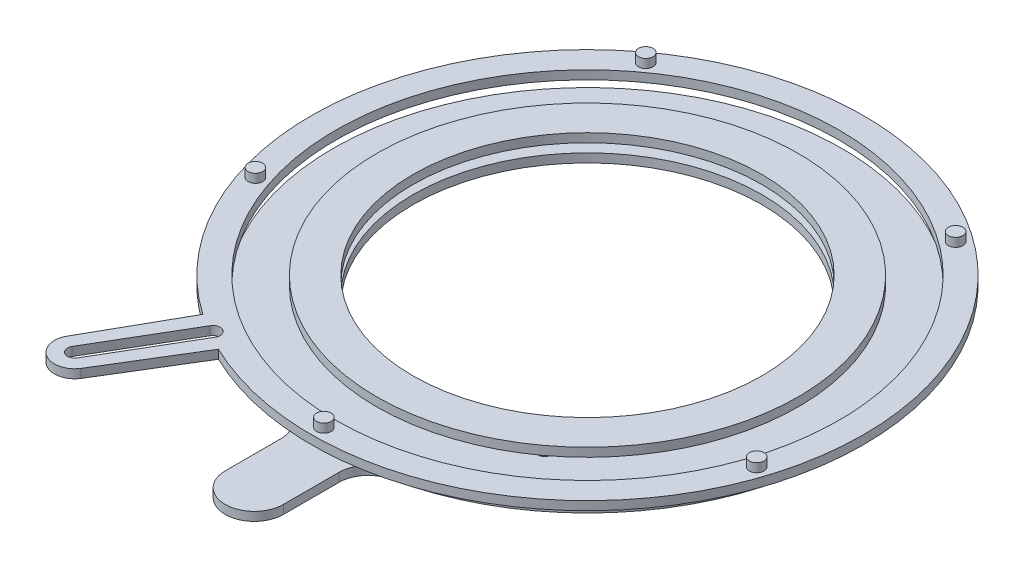
ISO-10303-21;
HEADER;
FILE_DESCRIPTION(('STEP AP214'),'2;1');
FILE_NAME('part.step','',(''),(''),'','','');
FILE_SCHEMA(('AUTOMOTIVE_DESIGN { 1 0 10303 214 1 1 1 1 }'));
ENDSEC;
DATA;
#1=APPLICATION_CONTEXT('core data for automotive mechanical design processes');
#2=APPLICATION_PROTOCOL_DEFINITION('international standard','automotive_design',2000,#1);
#3=PRODUCT_CONTEXT('',#1,'mechanical');
#4=PRODUCT('Part','Part','',(#3));
#5=PRODUCT_RELATED_PRODUCT_CATEGORY('part','',(#4));
#6=PRODUCT_DEFINITION_FORMATION('','',#4);
#7=PRODUCT_DEFINITION_CONTEXT('part definition',#1,'design');
#8=PRODUCT_DEFINITION('design','',#6,#7);
#9=PRODUCT_DEFINITION_SHAPE('','',#8);
#10=(LENGTH_UNIT() NAMED_UNIT(*) SI_UNIT(.MILLI.,.METRE.));
#11=(NAMED_UNIT(*) PLANE_ANGLE_UNIT() SI_UNIT($,.RADIAN.));
#12=(NAMED_UNIT(*) SI_UNIT($,.STERADIAN.) SOLID_ANGLE_UNIT());
#13=UNCERTAINTY_MEASURE_WITH_UNIT(LENGTH_MEASURE(1.E-05),#10,'distance_accuracy_value','');
#14=(GEOMETRIC_REPRESENTATION_CONTEXT(3) GLOBAL_UNCERTAINTY_ASSIGNED_CONTEXT((#13)) GLOBAL_UNIT_ASSIGNED_CONTEXT((#10,
#11,#12)) REPRESENTATION_CONTEXT('',''));
#15=CARTESIAN_POINT('',(0.,0.,0.));
#16=DIRECTION('',(0.,0.,1.));
#17=DIRECTION('',(1.,0.,0.));
#18=AXIS2_PLACEMENT_3D('',#15,#16,#17);
#19=CARTESIAN_POINT('',(-65.2234369421148,3.,111.10996485598));
#20=DIRECTION('',(0.,1.,0.));
#21=DIRECTION('',(0.,0.,1.));
#22=AXIS2_PLACEMENT_3D('',#19,#20,#21);
#23=PLANE('',#22);
#24=CARTESIAN_POINT('',(-86.2062632660735,3.,28.0101128737876));
#25=DIRECTION('',(0.,1.,0.));
#26=DIRECTION('',(-0.95105651629515,0.,0.309016994374958));
#27=AXIS2_PLACEMENT_3D('',#24,#25,#26);
#28=CIRCLE('',#27,2.5);
#29=CARTESIAN_POINT('',(-88.5839045568114,3.,28.782655359725));
#30=VERTEX_POINT('',#29);
#31=EDGE_CURVE('E129',#30,#30,#28,.T.);
#32=ORIENTED_EDGE('',*,*,#31,.F.);
#33=EDGE_LOOP('',(#32));
#34=FACE_BOUND('',#33,.T.);
#35=CARTESIAN_POINT('',(-53.2784007415558,3.,-73.331427532294));
#36=DIRECTION('',(0.,1.,0.));
#37=DIRECTION('',(-0.58778525229248,0.,-0.809016994374942));
#38=AXIS2_PLACEMENT_3D('',#35,#36,#37);
#39=CIRCLE('',#38,2.5);
#40=CARTESIAN_POINT('',(-54.747863872287,3.,-75.3539700182314));
#41=VERTEX_POINT('',#40);
#42=EDGE_CURVE('E152',#41,#41,#39,.T.);
#43=ORIENTED_EDGE('',*,*,#42,.F.);
#44=EDGE_LOOP('',(#43));
#45=FACE_BOUND('',#44,.T.);
#46=CARTESIAN_POINT('',(53.2784007415547,3.,-73.3314275322948));
#47=DIRECTION('',(0.,1.,0.));
#48=DIRECTION('',(0.587785252292469,0.,-0.809016994374951));
#49=AXIS2_PLACEMENT_3D('',#46,#47,#48);
#50=CIRCLE('',#49,2.5);
#51=CARTESIAN_POINT('',(54.7478638722859,3.,-75.3539700182321));
#52=VERTEX_POINT('',#51);
#53=EDGE_CURVE('E158',#52,#52,#50,.T.);
#54=ORIENTED_EDGE('',*,*,#53,.F.);
#55=EDGE_LOOP('',(#54));
#56=FACE_BOUND('',#55,.T.);
#57=CARTESIAN_POINT('',(86.2062632660739,3.,28.0101128737864));
#58=DIRECTION('',(0.,1.,0.));
#59=DIRECTION('',(0.951056516295155,0.,0.309016994374945));
#60=AXIS2_PLACEMENT_3D('',#57,#58,#59);
#61=CIRCLE('',#60,2.5);
#62=CARTESIAN_POINT('',(88.5839045568118,3.,28.7826553597238));
#63=VERTEX_POINT('',#62);
#64=EDGE_CURVE('E164',#63,#63,#61,.T.);
#65=ORIENTED_EDGE('',*,*,#64,.F.);
#66=EDGE_LOOP('',(#65));
#67=FACE_BOUND('',#66,.T.);
#68=CARTESIAN_POINT('',(0.,3.,90.6426293170156));
#69=DIRECTION('',(0.,1.,0.));
#70=DIRECTION('',(0.,0.,1.));
#71=AXIS2_PLACEMENT_3D('',#68,#69,#70);
#72=CIRCLE('',#71,2.5);
#73=CARTESIAN_POINT('',(0.,3.,93.1426293170156));
#74=VERTEX_POINT('',#73);
#75=EDGE_CURVE('E170',#74,#74,#72,.T.);
#76=ORIENTED_EDGE('',*,*,#75,.F.);
#77=EDGE_LOOP('',(#76));
#78=FACE_BOUND('',#77,.T.);
#79=CARTESIAN_POINT('',(-65.2234369421148,3.,111.10996485598));
#80=DIRECTION('',(0.,1.,0.));
#81=DIRECTION('',(0.,0.,1.));
#82=AXIS2_PLACEMENT_3D('',#79,#80,#81);
#83=CIRCLE('',#82,7.);
#84=CARTESIAN_POINT('',(-71.2350289516184,3.,107.523774466267));
#85=VERTEX_POINT('',#84);
#86=CARTESIAN_POINT('',(-59.3384338554631,3.,114.900312949506));
#87=VERTEX_POINT('',#86);
#88=EDGE_CURVE('E185',#85,#87,#83,.T.);
#89=ORIENTED_EDGE('',*,*,#88,.T.);
#90=DIRECTION('',(0.520962189839159,0.,-0.853579754187028));
#91=VECTOR('',#90,1.);
#92=CARTESIAN_POINT('',(-59.3384338554631,3.,114.900312949506));
#93=LINE('',#92,#91);
#94=CARTESIAN_POINT('',(-41.3980460225497,3.,85.5055658160032));
#95=VERTEX_POINT('',#94);
#96=EDGE_CURVE('E188',#87,#95,#93,.T.);
#97=ORIENTED_EDGE('',*,*,#96,.T.);
#98=CARTESIAN_POINT('',(0.,3.,0.));
#99=DIRECTION('',(0.,1.,0.));
#100=DIRECTION('',(0.,0.,1.));
#101=AXIS2_PLACEMENT_3D('',#98,#99,#100);
#102=CIRCLE('',#101,95.);
#103=CARTESIAN_POINT('',(-54.4803694238336,3.,77.8260197327514));
#104=VERTEX_POINT('',#103);
#105=EDGE_CURVE('E191',#95,#104,#102,.T.);
#106=ORIENTED_EDGE('',*,*,#105,.T.);
#107=DIRECTION('',(-0.491367460051332,0.,0.870952363337228));
#108=VECTOR('',#107,1.);
#109=CARTESIAN_POINT('',(-71.2350289516184,3.,107.523774466267));
#110=LINE('',#109,#108);
#111=EDGE_CURVE('E193',#104,#85,#110,.T.);
#112=ORIENTED_EDGE('',*,*,#111,.T.);
#113=EDGE_LOOP('',(#89,#97,#106,#112));
#114=FACE_BOUND('',#113,.T.);
#115=CARTESIAN_POINT('',(0.,3.,0.));
#116=DIRECTION('',(0.,1.,0.));
#117=DIRECTION('',(0.,0.,1.));
#118=AXIS2_PLACEMENT_3D('',#115,#116,#117);
#119=CIRCLE('',#118,86.5);
#120=CARTESIAN_POINT('',(0.,3.,86.5));
#121=VERTEX_POINT('',#120);
#122=EDGE_CURVE('E179',#121,#121,#119,.T.);
#123=ORIENTED_EDGE('',*,*,#122,.F.);
#124=EDGE_LOOP('',(#123));
#125=FACE_BOUND('',#124,.T.);
#126=DIRECTION('',(0.506239352380876,0.,-0.862393018351257));
#127=VECTOR('',#126,1.);
#128=CARTESIAN_POINT('',(-63.0674543962367,3.,112.375563236932));
#129=LINE('',#128,#127);
#130=CARTESIAN_POINT('',(-63.0674543962367,3.,112.375563236932));
#131=VERTEX_POINT('',#130);
#132=CARTESIAN_POINT('',(-45.5100512310858,3.,82.4660316313913));
#133=VERTEX_POINT('',#132);
#134=EDGE_CURVE('E121',#131,#133,#129,.T.);
#135=ORIENTED_EDGE('',*,*,#134,.F.);
#136=CARTESIAN_POINT('',(-65.2234369421148,3.,111.10996485598));
#137=DIRECTION('',(0.,1.,0.));
#138=DIRECTION('',(0.,0.,1.));
#139=AXIS2_PLACEMENT_3D('',#136,#137,#138);
#140=CIRCLE('',#139,2.49999999999999);
#141=CARTESIAN_POINT('',(-67.379419487993,3.,109.844366475028));
#142=VERTEX_POINT('',#141);
#143=EDGE_CURVE('E113',#142,#131,#140,.T.);
#144=ORIENTED_EDGE('',*,*,#143,.F.);
#145=DIRECTION('',(-0.506239352380876,0.,0.862393018351257));
#146=VECTOR('',#145,1.);
#147=CARTESIAN_POINT('',(-67.379419487993,3.,109.844366475028));
#148=LINE('',#147,#146);
#149=CARTESIAN_POINT('',(-49.8220163228421,3.,79.9348348694869));
#150=VERTEX_POINT('',#149);
#151=EDGE_CURVE('E135',#150,#142,#148,.T.);
#152=ORIENTED_EDGE('',*,*,#151,.F.);
#153=CARTESIAN_POINT('',(-47.666033776964,3.,81.2004332504391));
#154=DIRECTION('',(0.,1.,0.));
#155=DIRECTION('',(0.,0.,1.));
#156=AXIS2_PLACEMENT_3D('',#153,#154,#155);
#157=CIRCLE('',#156,2.49999999999999);
#158=EDGE_CURVE('E133',#133,#150,#157,.T.);
#159=ORIENTED_EDGE('',*,*,#158,.F.);
#160=EDGE_LOOP('',(#135,#144,#152,#159));
#161=FACE_BOUND('',#160,.T.);
#162=ADVANCED_FACE('F48',(#34,#45,#56,#67,#78,#114,#125,#161),#23,.T.);
#163=CARTESIAN_POINT('',(-65.2234369421148,0.,111.10996485598));
#164=DIRECTION('',(0.,1.,0.));
#165=DIRECTION('',(0.,0.,1.));
#166=AXIS2_PLACEMENT_3D('',#163,#164,#165);
#167=PLANE('',#166);
#168=CARTESIAN_POINT('',(0.,0.,0.));
#169=DIRECTION('',(0.,1.,0.));
#170=DIRECTION('',(0.,0.,1.));
#171=AXIS2_PLACEMENT_3D('',#168,#169,#170);
#172=CIRCLE('',#171,86.5);
#173=CARTESIAN_POINT('',(0.,0.,86.5));
#174=VERTEX_POINT('',#173);
#175=EDGE_CURVE('E176',#174,#174,#172,.T.);
#176=ORIENTED_EDGE('',*,*,#175,.T.);
#177=EDGE_LOOP('',(#176));
#178=FACE_BOUND('',#177,.T.);
#179=CARTESIAN_POINT('',(-65.2234369421148,0.,111.10996485598));
#180=DIRECTION('',(0.,1.,0.));
#181=DIRECTION('',(0.,0.,1.));
#182=AXIS2_PLACEMENT_3D('',#179,#180,#181);
#183=CIRCLE('',#182,7.);
#184=CARTESIAN_POINT('',(-71.2350289516184,0.,107.523774466267));
#185=VERTEX_POINT('',#184);
#186=CARTESIAN_POINT('',(-59.3384338554631,0.,114.900312949506));
#187=VERTEX_POINT('',#186);
#188=EDGE_CURVE('E182',#185,#187,#183,.T.);
#189=ORIENTED_EDGE('',*,*,#188,.F.);
#190=DIRECTION('',(-0.491367460051332,0.,0.870952363337228));
#191=VECTOR('',#190,1.);
#192=CARTESIAN_POINT('',(-71.2350289516184,0.,107.523774466267));
#193=LINE('',#192,#191);
#194=CARTESIAN_POINT('',(-54.4803694238336,0.,77.8260197327514));
#195=VERTEX_POINT('',#194);
#196=EDGE_CURVE('E189',#195,#185,#193,.T.);
#197=ORIENTED_EDGE('',*,*,#196,.F.);
#198=CARTESIAN_POINT('',(0.,0.,0.));
#199=DIRECTION('',(0.,1.,0.));
#200=DIRECTION('',(0.,0.,1.));
#201=AXIS2_PLACEMENT_3D('',#198,#199,#200);
#202=CIRCLE('',#201,95.);
#203=CARTESIAN_POINT('',(-41.3980460225497,0.,85.5055658160032));
#204=VERTEX_POINT('',#203);
#205=EDGE_CURVE('E200',#204,#195,#202,.T.);
#206=ORIENTED_EDGE('',*,*,#205,.F.);
#207=DIRECTION('',(0.520962189839159,0.,-0.853579754187028));
#208=VECTOR('',#207,1.);
#209=CARTESIAN_POINT('',(-59.3384338554631,0.,114.900312949506));
#210=LINE('',#209,#208);
#211=EDGE_CURVE('E198',#187,#204,#210,.T.);
#212=ORIENTED_EDGE('',*,*,#211,.F.);
#213=EDGE_LOOP('',(#189,#197,#206,#212));
#214=FACE_BOUND('',#213,.T.);
#215=CARTESIAN_POINT('',(-65.2234369421148,0.,111.10996485598));
#216=DIRECTION('',(0.,1.,0.));
#217=DIRECTION('',(0.,0.,1.));
#218=AXIS2_PLACEMENT_3D('',#215,#216,#217);
#219=CIRCLE('',#218,2.49999999999999);
#220=CARTESIAN_POINT('',(-67.379419487993,0.,109.844366475028));
#221=VERTEX_POINT('',#220);
#222=CARTESIAN_POINT('',(-63.0674543962367,0.,112.375563236932));
#223=VERTEX_POINT('',#222);
#224=EDGE_CURVE('E71',#221,#223,#219,.T.);
#225=ORIENTED_EDGE('',*,*,#224,.T.);
#226=DIRECTION('',(0.506239352380876,0.,-0.862393018351257));
#227=VECTOR('',#226,1.);
#228=CARTESIAN_POINT('',(-63.0674543962367,0.,112.375563236932));
#229=LINE('',#228,#227);
#230=CARTESIAN_POINT('',(-45.5100512310858,0.,82.4660316313913));
#231=VERTEX_POINT('',#230);
#232=EDGE_CURVE('E128',#223,#231,#229,.T.);
#233=ORIENTED_EDGE('',*,*,#232,.T.);
#234=CARTESIAN_POINT('',(-47.666033776964,0.,81.2004332504391));
#235=DIRECTION('',(0.,1.,0.));
#236=DIRECTION('',(0.,0.,1.));
#237=AXIS2_PLACEMENT_3D('',#234,#235,#236);
#238=CIRCLE('',#237,2.49999999999999);
#239=CARTESIAN_POINT('',(-49.8220163228421,0.,79.9348348694869));
#240=VERTEX_POINT('',#239);
#241=EDGE_CURVE('E141',#231,#240,#238,.T.);
#242=ORIENTED_EDGE('',*,*,#241,.T.);
#243=DIRECTION('',(-0.506239352380876,0.,0.862393018351257));
#244=VECTOR('',#243,1.);
#245=CARTESIAN_POINT('',(-67.379419487993,0.,109.844366475028));
#246=LINE('',#245,#244);
#247=EDGE_CURVE('E122',#240,#221,#246,.T.);
#248=ORIENTED_EDGE('',*,*,#247,.T.);
#249=EDGE_LOOP('',(#225,#233,#242,#248));
#250=FACE_BOUND('',#249,.T.);
#251=ADVANCED_FACE('F218',(#178,#214,#250),#167,.F.);
#252=CARTESIAN_POINT('',(-65.2234369421148,3.,111.10996485598));
#253=DIRECTION('',(0.,-1.,0.));
#254=DIRECTION('',(0.,0.,-1.));
#255=AXIS2_PLACEMENT_3D('',#252,#253,#254);
#256=CYLINDRICAL_SURFACE('',#255,7.);
#257=ORIENTED_EDGE('',*,*,#188,.T.);
#258=DIRECTION('',(0.,-1.,0.));
#259=VECTOR('',#258,1.);
#260=CARTESIAN_POINT('',(-59.3384338554631,3.,114.900312949506));
#261=LINE('',#260,#259);
#262=EDGE_CURVE('E12',#87,#187,#261,.T.);
#263=ORIENTED_EDGE('',*,*,#262,.F.);
#264=ORIENTED_EDGE('',*,*,#88,.F.);
#265=DIRECTION('',(0.,-1.,0.));
#266=VECTOR('',#265,1.);
#267=CARTESIAN_POINT('',(-71.2350289516184,3.,107.523774466267));
#268=LINE('',#267,#266);
#269=EDGE_CURVE('E195',#85,#185,#268,.T.);
#270=ORIENTED_EDGE('',*,*,#269,.T.);
#271=EDGE_LOOP('',(#257,#263,#264,#270));
#272=FACE_BOUND('',#271,.T.);
#273=ADVANCED_FACE('F50',(#272),#256,.T.);
#274=CARTESIAN_POINT('',(-59.3384338554631,3.,114.900312949506));
#275=DIRECTION('',(-0.853579754187028,0.,-0.520962189839159));
#276=DIRECTION('',(-0.520962189839159,0.,0.853579754187029));
#277=AXIS2_PLACEMENT_3D('',#274,#275,#276);
#278=PLANE('',#277);
#279=ORIENTED_EDGE('',*,*,#211,.T.);
#280=DIRECTION('',(0.,-1.,0.));
#281=VECTOR('',#280,1.);
#282=CARTESIAN_POINT('',(-41.3980460225497,3.,85.5055658160032));
#283=LINE('',#282,#281);
#284=EDGE_CURVE('E56',#95,#204,#283,.T.);
#285=ORIENTED_EDGE('',*,*,#284,.F.);
#286=ORIENTED_EDGE('',*,*,#96,.F.);
#287=ORIENTED_EDGE('',*,*,#262,.T.);
#288=EDGE_LOOP('',(#279,#285,#286,#287));
#289=FACE_BOUND('',#288,.T.);
#290=ADVANCED_FACE('F229',(#289),#278,.F.);
#291=CARTESIAN_POINT('',(0.,3.,0.));
#292=DIRECTION('',(0.,-1.,0.));
#293=DIRECTION('',(0.,0.,-1.));
#294=AXIS2_PLACEMENT_3D('',#291,#292,#293);
#295=CYLINDRICAL_SURFACE('',#294,95.);
#296=ORIENTED_EDGE('',*,*,#205,.T.);
#297=DIRECTION('',(0.,-1.,0.));
#298=VECTOR('',#297,1.);
#299=CARTESIAN_POINT('',(-54.4803694238336,3.,77.8260197327514));
#300=LINE('',#299,#298);
#301=EDGE_CURVE('E205',#104,#195,#300,.T.);
#302=ORIENTED_EDGE('',*,*,#301,.F.);
#303=ORIENTED_EDGE('',*,*,#105,.F.);
#304=ORIENTED_EDGE('',*,*,#284,.T.);
#305=EDGE_LOOP('',(#296,#302,#303,#304));
#306=FACE_BOUND('',#305,.T.);
#307=ADVANCED_FACE('F212',(#306),#295,.T.);
#308=CARTESIAN_POINT('',(-71.2350289516184,3.,107.523774466267));
#309=DIRECTION('',(0.870952363337228,0.,0.491367460051332));
#310=DIRECTION('',(0.491367460051332,0.,-0.870952363337228));
#311=AXIS2_PLACEMENT_3D('',#308,#309,#310);
#312=PLANE('',#311);
#313=ORIENTED_EDGE('',*,*,#196,.T.);
#314=ORIENTED_EDGE('',*,*,#269,.F.);
#315=ORIENTED_EDGE('',*,*,#111,.F.);
#316=ORIENTED_EDGE('',*,*,#301,.T.);
#317=EDGE_LOOP('',(#313,#314,#315,#316));
#318=FACE_BOUND('',#317,.T.);
#319=ADVANCED_FACE('F222',(#318),#312,.F.);
#320=CARTESIAN_POINT('',(0.,3.,0.));
#321=DIRECTION('',(0.,-1.,0.));
#322=DIRECTION('',(0.,0.,-1.));
#323=AXIS2_PLACEMENT_3D('',#320,#321,#322);
#324=CYLINDRICAL_SURFACE('',#323,86.5);
#325=ORIENTED_EDGE('',*,*,#122,.T.);
#326=EDGE_LOOP('',(#325));
#327=FACE_BOUND('',#326,.T.);
#328=ORIENTED_EDGE('',*,*,#175,.F.);
#329=EDGE_LOOP('',(#328));
#330=FACE_BOUND('',#329,.T.);
#331=ADVANCED_FACE('F247',(#327,#330),#324,.F.);
#332=CARTESIAN_POINT('',(0.,6.,90.6426293170156));
#333=DIRECTION('',(0.,-1.,0.));
#334=DIRECTION('',(0.,0.,-1.));
#335=AXIS2_PLACEMENT_3D('',#332,#333,#334);
#336=CYLINDRICAL_SURFACE('',#335,2.5);
#337=CARTESIAN_POINT('',(0.,6.,90.6426293170156));
#338=DIRECTION('',(0.,1.,0.));
#339=DIRECTION('',(0.,0.,1.));
#340=AXIS2_PLACEMENT_3D('',#337,#338,#339);
#341=CIRCLE('',#340,2.5);
#342=CARTESIAN_POINT('',(0.,6.,93.1426293170156));
#343=VERTEX_POINT('',#342);
#344=EDGE_CURVE('E173',#343,#343,#341,.T.);
#345=ORIENTED_EDGE('',*,*,#344,.F.);
#346=EDGE_LOOP('',(#345));
#347=FACE_BOUND('',#346,.T.);
#348=ORIENTED_EDGE('',*,*,#75,.T.);
#349=EDGE_LOOP('',(#348));
#350=FACE_BOUND('',#349,.T.);
#351=ADVANCED_FACE('F254',(#347,#350),#336,.T.);
#352=CARTESIAN_POINT('',(0.,6.,90.6426293170156));
#353=DIRECTION('',(0.,1.,0.));
#354=DIRECTION('',(0.,0.,1.));
#355=AXIS2_PLACEMENT_3D('',#352,#353,#354);
#356=PLANE('',#355);
#357=ORIENTED_EDGE('',*,*,#344,.T.);
#358=EDGE_LOOP('',(#357));
#359=FACE_BOUND('',#358,.T.);
#360=ADVANCED_FACE('F259',(#359),#356,.T.);
#361=CARTESIAN_POINT('',(86.2062632660739,6.,28.0101128737864));
#362=DIRECTION('',(0.,-1.,0.));
#363=DIRECTION('',(0.,0.,-1.));
#364=AXIS2_PLACEMENT_3D('',#361,#362,#363);
#365=CYLINDRICAL_SURFACE('',#364,2.5);
#366=CARTESIAN_POINT('',(86.2062632660739,6.,28.0101128737864));
#367=DIRECTION('',(0.,1.,0.));
#368=DIRECTION('',(0.951056516295155,0.,0.309016994374945));
#369=AXIS2_PLACEMENT_3D('',#366,#367,#368);
#370=CIRCLE('',#369,2.5);
#371=CARTESIAN_POINT('',(88.5839045568118,6.,28.7826553597238));
#372=VERTEX_POINT('',#371);
#373=EDGE_CURVE('E167',#372,#372,#370,.T.);
#374=ORIENTED_EDGE('',*,*,#373,.F.);
#375=EDGE_LOOP('',(#374));
#376=FACE_BOUND('',#375,.T.);
#377=ORIENTED_EDGE('',*,*,#64,.T.);
#378=EDGE_LOOP('',(#377));
#379=FACE_BOUND('',#378,.T.);
#380=ADVANCED_FACE('F267',(#376,#379),#365,.T.);
#381=CARTESIAN_POINT('',(86.2062632660739,6.,28.0101128737864));
#382=DIRECTION('',(0.,1.,0.));
#383=DIRECTION('',(0.951056516295155,0.,0.309016994374945));
#384=AXIS2_PLACEMENT_3D('',#381,#382,#383);
#385=PLANE('',#384);
#386=ORIENTED_EDGE('',*,*,#373,.T.);
#387=EDGE_LOOP('',(#386));
#388=FACE_BOUND('',#387,.T.);
#389=ADVANCED_FACE('F275',(#388),#385,.T.);
#390=CARTESIAN_POINT('',(53.2784007415547,6.,-73.3314275322948));
#391=DIRECTION('',(0.,-1.,0.));
#392=DIRECTION('',(0.,0.,-1.));
#393=AXIS2_PLACEMENT_3D('',#390,#391,#392);
#394=CYLINDRICAL_SURFACE('',#393,2.5);
#395=CARTESIAN_POINT('',(53.2784007415547,6.,-73.3314275322948));
#396=DIRECTION('',(0.,1.,0.));
#397=DIRECTION('',(0.587785252292469,0.,-0.809016994374951));
#398=AXIS2_PLACEMENT_3D('',#395,#396,#397);
#399=CIRCLE('',#398,2.5);
#400=CARTESIAN_POINT('',(54.7478638722859,6.,-75.3539700182321));
#401=VERTEX_POINT('',#400);
#402=EDGE_CURVE('E161',#401,#401,#399,.T.);
#403=ORIENTED_EDGE('',*,*,#402,.F.);
#404=EDGE_LOOP('',(#403));
#405=FACE_BOUND('',#404,.T.);
#406=ORIENTED_EDGE('',*,*,#53,.T.);
#407=EDGE_LOOP('',(#406));
#408=FACE_BOUND('',#407,.T.);
#409=ADVANCED_FACE('F279',(#405,#408),#394,.T.);
#410=CARTESIAN_POINT('',(53.2784007415547,6.,-73.3314275322948));
#411=DIRECTION('',(0.,1.,0.));
#412=DIRECTION('',(0.587785252292469,0.,-0.809016994374951));
#413=AXIS2_PLACEMENT_3D('',#410,#411,#412);
#414=PLANE('',#413);
#415=ORIENTED_EDGE('',*,*,#402,.T.);
#416=EDGE_LOOP('',(#415));
#417=FACE_BOUND('',#416,.T.);
#418=ADVANCED_FACE('F283',(#417),#414,.T.);
#419=CARTESIAN_POINT('',(-53.2784007415558,6.,-73.331427532294));
#420=DIRECTION('',(0.,-1.,0.));
#421=DIRECTION('',(0.,0.,-1.));
#422=AXIS2_PLACEMENT_3D('',#419,#420,#421);
#423=CYLINDRICAL_SURFACE('',#422,2.5);
#424=CARTESIAN_POINT('',(-53.2784007415558,6.,-73.331427532294));
#425=DIRECTION('',(0.,1.,0.));
#426=DIRECTION('',(-0.58778525229248,0.,-0.809016994374942));
#427=AXIS2_PLACEMENT_3D('',#424,#425,#426);
#428=CIRCLE('',#427,2.5);
#429=CARTESIAN_POINT('',(-54.747863872287,6.,-75.3539700182314));
#430=VERTEX_POINT('',#429);
#431=EDGE_CURVE('E155',#430,#430,#428,.T.);
#432=ORIENTED_EDGE('',*,*,#431,.F.);
#433=EDGE_LOOP('',(#432));
#434=FACE_BOUND('',#433,.T.);
#435=ORIENTED_EDGE('',*,*,#42,.T.);
#436=EDGE_LOOP('',(#435));
#437=FACE_BOUND('',#436,.T.);
#438=ADVANCED_FACE('F287',(#434,#437),#423,.T.);
#439=CARTESIAN_POINT('',(-53.2784007415558,6.,-73.331427532294));
#440=DIRECTION('',(0.,1.,0.));
#441=DIRECTION('',(-0.58778525229248,0.,-0.809016994374942));
#442=AXIS2_PLACEMENT_3D('',#439,#440,#441);
#443=PLANE('',#442);
#444=ORIENTED_EDGE('',*,*,#431,.T.);
#445=EDGE_LOOP('',(#444));
#446=FACE_BOUND('',#445,.T.);
#447=ADVANCED_FACE('F291',(#446),#443,.T.);
#448=CARTESIAN_POINT('',(-86.2062632660735,6.,28.0101128737876));
#449=DIRECTION('',(0.,-1.,0.));
#450=DIRECTION('',(0.,0.,-1.));
#451=AXIS2_PLACEMENT_3D('',#448,#449,#450);
#452=CYLINDRICAL_SURFACE('',#451,2.5);
#453=CARTESIAN_POINT('',(-86.2062632660735,6.,28.0101128737876));
#454=DIRECTION('',(0.,1.,0.));
#455=DIRECTION('',(-0.95105651629515,0.,0.309016994374958));
#456=AXIS2_PLACEMENT_3D('',#453,#454,#455);
#457=CIRCLE('',#456,2.5);
#458=CARTESIAN_POINT('',(-88.5839045568114,6.,28.782655359725));
#459=VERTEX_POINT('',#458);
#460=EDGE_CURVE('E149',#459,#459,#457,.T.);
#461=ORIENTED_EDGE('',*,*,#460,.F.);
#462=EDGE_LOOP('',(#461));
#463=FACE_BOUND('',#462,.T.);
#464=ORIENTED_EDGE('',*,*,#31,.T.);
#465=EDGE_LOOP('',(#464));
#466=FACE_BOUND('',#465,.T.);
#467=ADVANCED_FACE('F295',(#463,#466),#452,.T.);
#468=CARTESIAN_POINT('',(-86.2062632660735,6.,28.0101128737876));
#469=DIRECTION('',(0.,1.,0.));
#470=DIRECTION('',(-0.95105651629515,0.,0.309016994374958));
#471=AXIS2_PLACEMENT_3D('',#468,#469,#470);
#472=PLANE('',#471);
#473=ORIENTED_EDGE('',*,*,#460,.T.);
#474=EDGE_LOOP('',(#473));
#475=FACE_BOUND('',#474,.T.);
#476=ADVANCED_FACE('F299',(#475),#472,.T.);
#477=CARTESIAN_POINT('',(-65.2234369421148,3.,111.10996485598));
#478=DIRECTION('',(0.,-1.,0.));
#479=DIRECTION('',(0.,0.,-1.));
#480=AXIS2_PLACEMENT_3D('',#477,#478,#479);
#481=CYLINDRICAL_SURFACE('',#480,2.49999999999999);
#482=ORIENTED_EDGE('',*,*,#224,.F.);
#483=DIRECTION('',(0.,-1.,0.));
#484=VECTOR('',#483,1.);
#485=CARTESIAN_POINT('',(-67.379419487993,3.,109.844366475028));
#486=LINE('',#485,#484);
#487=EDGE_CURVE('E117',#142,#221,#486,.T.);
#488=ORIENTED_EDGE('',*,*,#487,.F.);
#489=ORIENTED_EDGE('',*,*,#143,.T.);
#490=DIRECTION('',(0.,-1.,0.));
#491=VECTOR('',#490,1.);
#492=CARTESIAN_POINT('',(-63.0674543962367,3.,112.375563236932));
#493=LINE('',#492,#491);
#494=EDGE_CURVE('E116',#131,#223,#493,.T.);
#495=ORIENTED_EDGE('',*,*,#494,.T.);
#496=EDGE_LOOP('',(#482,#488,#489,#495));
#497=FACE_BOUND('',#496,.T.);
#498=ADVANCED_FACE('F115',(#497),#481,.F.);
#499=CARTESIAN_POINT('',(-63.0674543962367,3.,112.375563236932));
#500=DIRECTION('',(-0.862393018351257,0.,-0.506239352380876));
#501=DIRECTION('',(-0.506239352380876,0.,0.862393018351257));
#502=AXIS2_PLACEMENT_3D('',#499,#500,#501);
#503=PLANE('',#502);
#504=ORIENTED_EDGE('',*,*,#232,.F.);
#505=ORIENTED_EDGE('',*,*,#494,.F.);
#506=ORIENTED_EDGE('',*,*,#134,.T.);
#507=DIRECTION('',(0.,-1.,0.));
#508=VECTOR('',#507,1.);
#509=CARTESIAN_POINT('',(-45.5100512310858,3.,82.4660316313913));
#510=LINE('',#509,#508);
#511=EDGE_CURVE('E130',#133,#231,#510,.T.);
#512=ORIENTED_EDGE('',*,*,#511,.T.);
#513=EDGE_LOOP('',(#504,#505,#506,#512));
#514=FACE_BOUND('',#513,.T.);
#515=ADVANCED_FACE('F125',(#514),#503,.T.);
#516=CARTESIAN_POINT('',(-47.666033776964,3.,81.2004332504391));
#517=DIRECTION('',(0.,-1.,0.));
#518=DIRECTION('',(0.,0.,-1.));
#519=AXIS2_PLACEMENT_3D('',#516,#517,#518);
#520=CYLINDRICAL_SURFACE('',#519,2.49999999999999);
#521=ORIENTED_EDGE('',*,*,#241,.F.);
#522=ORIENTED_EDGE('',*,*,#511,.F.);
#523=ORIENTED_EDGE('',*,*,#158,.T.);
#524=DIRECTION('',(0.,-1.,0.));
#525=VECTOR('',#524,1.);
#526=CARTESIAN_POINT('',(-49.8220163228421,3.,79.9348348694869));
#527=LINE('',#526,#525);
#528=EDGE_CURVE('E63',#150,#240,#527,.T.);
#529=ORIENTED_EDGE('',*,*,#528,.T.);
#530=EDGE_LOOP('',(#521,#522,#523,#529));
#531=FACE_BOUND('',#530,.T.);
#532=ADVANCED_FACE('F308',(#531),#520,.F.);
#533=CARTESIAN_POINT('',(-67.379419487993,3.,109.844366475028));
#534=DIRECTION('',(0.862393018351257,0.,0.506239352380876));
#535=DIRECTION('',(0.506239352380876,0.,-0.862393018351257));
#536=AXIS2_PLACEMENT_3D('',#533,#534,#535);
#537=PLANE('',#536);
#538=ORIENTED_EDGE('',*,*,#247,.F.);
#539=ORIENTED_EDGE('',*,*,#528,.F.);
#540=ORIENTED_EDGE('',*,*,#151,.T.);
#541=ORIENTED_EDGE('',*,*,#487,.T.);
#542=EDGE_LOOP('',(#538,#539,#540,#541));
#543=FACE_BOUND('',#542,.T.);
#544=ADVANCED_FACE('F311',(#543),#537,.T.);
#545=CLOSED_SHELL('',(#162,#251,#273,#290,#307,#319,#331,#351,#360,#380,#389,#409,#418,#438,
#447,#467,#476,#498,#515,#532,#544));
#546=MANIFOLD_SOLID_BREP('B2',#545);
#547=CARTESIAN_POINT('',(0.,3.,0.));
#548=DIRECTION('',(0.,1.,0.));
#549=DIRECTION('',(0.,0.,1.));
#550=AXIS2_PLACEMENT_3D('',#547,#548,#549);
#551=PLANE('',#550);
#552=CARTESIAN_POINT('',(0.,3.,0.));
#553=DIRECTION('',(0.,1.,0.));
#554=DIRECTION('',(0.,0.,1.));
#555=AXIS2_PLACEMENT_3D('',#552,#553,#554);
#556=CIRCLE('',#555,72.5);
#557=CARTESIAN_POINT('',(0.,3.,72.5));
#558=VERTEX_POINT('',#557);
#559=EDGE_CURVE('E46',#558,#558,#556,.T.);
#560=ORIENTED_EDGE('',*,*,#559,.T.);
#561=EDGE_LOOP('',(#560));
#562=FACE_BOUND('',#561,.T.);
#563=CARTESIAN_POINT('',(0.,3.,0.));
#564=DIRECTION('',(0.,1.,0.));
#565=DIRECTION('',(0.,0.,1.));
#566=AXIS2_PLACEMENT_3D('',#563,#564,#565);
#567=CIRCLE('',#566,60.);
#568=CARTESIAN_POINT('',(0.,3.,60.));
#569=VERTEX_POINT('',#568);
#570=EDGE_CURVE('E586',#569,#569,#567,.T.);
#571=ORIENTED_EDGE('',*,*,#570,.F.);
#572=EDGE_LOOP('',(#571));
#573=FACE_BOUND('',#572,.T.);
#574=ADVANCED_FACE('F448',(#562,#573),#551,.T.);
#575=CARTESIAN_POINT('',(0.,0.,0.));
#576=DIRECTION('',(0.,1.,0.));
#577=DIRECTION('',(0.,0.,1.));
#578=AXIS2_PLACEMENT_3D('',#575,#576,#577);
#579=PLANE('',#578);
#580=CARTESIAN_POINT('',(63.0074942045537,0.,-20.472375877341));
#581=DIRECTION('',(0.,1.,0.));
#582=DIRECTION('',(-0.95105651629515,0.,0.309016994374958));
#583=AXIS2_PLACEMENT_3D('',#580,#581,#582);
#584=CIRCLE('',#583,2.5);
#585=CARTESIAN_POINT('',(60.6298529138158,0.,-19.6998333914036));
#586=VERTEX_POINT('',#585);
#587=EDGE_CURVE('E559',#586,#586,#584,.T.);
#588=ORIENTED_EDGE('',*,*,#587,.T.);
#589=EDGE_LOOP('',(#588));
#590=FACE_BOUND('',#589,.T.);
#591=CARTESIAN_POINT('',(38.9407729643768,0.,53.5973758773399));
#592=DIRECTION('',(0.,1.,0.));
#593=DIRECTION('',(-0.58778525229248,0.,-0.809016994374942));
#594=AXIS2_PLACEMENT_3D('',#591,#592,#593);
#595=CIRCLE('',#594,2.5);
#596=CARTESIAN_POINT('',(37.4713098336456,0.,51.5748333914026));
#597=VERTEX_POINT('',#596);
#598=EDGE_CURVE('E562',#597,#597,#595,.T.);
#599=ORIENTED_EDGE('',*,*,#598,.T.);
#600=EDGE_LOOP('',(#599));
#601=FACE_BOUND('',#600,.T.);
#602=CARTESIAN_POINT('',(-38.940772964376,0.,53.5973758773405));
#603=DIRECTION('',(0.,1.,0.));
#604=DIRECTION('',(0.587785252292469,0.,-0.809016994374951));
#605=AXIS2_PLACEMENT_3D('',#602,#603,#604);
#606=CIRCLE('',#605,2.5);
#607=CARTESIAN_POINT('',(-37.4713098336449,0.,51.5748333914031));
#608=VERTEX_POINT('',#607);
#609=EDGE_CURVE('E569',#608,#608,#606,.T.);
#610=ORIENTED_EDGE('',*,*,#609,.T.);
#611=EDGE_LOOP('',(#610));
#612=FACE_BOUND('',#611,.T.);
#613=CARTESIAN_POINT('',(-63.007494204554,0.,-20.4723758773401));
#614=DIRECTION('',(0.,1.,0.));
#615=DIRECTION('',(0.951056516295155,0.,0.309016994374945));
#616=AXIS2_PLACEMENT_3D('',#613,#614,#615);
#617=CIRCLE('',#616,2.5);
#618=CARTESIAN_POINT('',(-60.6298529138161,0.,-19.6998333914027));
#619=VERTEX_POINT('',#618);
#620=EDGE_CURVE('E575',#619,#619,#617,.T.);
#621=ORIENTED_EDGE('',*,*,#620,.T.);
#622=EDGE_LOOP('',(#621));
#623=FACE_BOUND('',#622,.T.);
#624=CARTESIAN_POINT('',(0.,0.,-66.25));
#625=DIRECTION('',(0.,1.,0.));
#626=DIRECTION('',(0.,0.,1.));
#627=AXIS2_PLACEMENT_3D('',#624,#625,#626);
#628=CIRCLE('',#627,2.5);
#629=CARTESIAN_POINT('',(0.,0.,-63.75));
#630=VERTEX_POINT('',#629);
#631=EDGE_CURVE('E580',#630,#630,#628,.T.);
#632=ORIENTED_EDGE('',*,*,#631,.T.);
#633=EDGE_LOOP('',(#632));
#634=FACE_BOUND('',#633,.T.);
#635=CARTESIAN_POINT('',(0.,0.,0.));
#636=DIRECTION('',(0.,1.,0.));
#637=DIRECTION('',(0.,0.,1.));
#638=AXIS2_PLACEMENT_3D('',#635,#636,#637);
#639=CIRCLE('',#638,72.5);
#640=CARTESIAN_POINT('',(0.,0.,72.5));
#641=VERTEX_POINT('',#640);
#642=EDGE_CURVE('E452',#641,#641,#639,.T.);
#643=ORIENTED_EDGE('',*,*,#642,.F.);
#644=EDGE_LOOP('',(#643));
#645=FACE_BOUND('',#644,.T.);
#646=CARTESIAN_POINT('',(0.,0.,0.));
#647=DIRECTION('',(0.,1.,0.));
#648=DIRECTION('',(0.,0.,1.));
#649=AXIS2_PLACEMENT_3D('',#646,#647,#648);
#650=CIRCLE('',#649,60.);
#651=CARTESIAN_POINT('',(0.,0.,60.));
#652=VERTEX_POINT('',#651);
#653=EDGE_CURVE('E585',#652,#652,#650,.T.);
#654=ORIENTED_EDGE('',*,*,#653,.T.);
#655=EDGE_LOOP('',(#654));
#656=FACE_BOUND('',#655,.T.);
#657=ADVANCED_FACE('F592',(#590,#601,#612,#623,#634,#645,#656),#579,.F.);
#658=CARTESIAN_POINT('',(0.,3.,0.));
#659=DIRECTION('',(0.,-1.,0.));
#660=DIRECTION('',(0.,0.,-1.));
#661=AXIS2_PLACEMENT_3D('',#658,#659,#660);
#662=CYLINDRICAL_SURFACE('',#661,72.5);
#663=ORIENTED_EDGE('',*,*,#559,.F.);
#664=EDGE_LOOP('',(#663));
#665=FACE_BOUND('',#664,.T.);
#666=ORIENTED_EDGE('',*,*,#642,.T.);
#667=EDGE_LOOP('',(#666));
#668=FACE_BOUND('',#667,.T.);
#669=ADVANCED_FACE('F450',(#665,#668),#662,.T.);
#670=CARTESIAN_POINT('',(0.,3.,0.));
#671=DIRECTION('',(0.,-1.,0.));
#672=DIRECTION('',(0.,0.,-1.));
#673=AXIS2_PLACEMENT_3D('',#670,#671,#672);
#674=CYLINDRICAL_SURFACE('',#673,60.);
#675=ORIENTED_EDGE('',*,*,#570,.T.);
#676=EDGE_LOOP('',(#675));
#677=FACE_BOUND('',#676,.T.);
#678=ORIENTED_EDGE('',*,*,#653,.F.);
#679=EDGE_LOOP('',(#678));
#680=FACE_BOUND('',#679,.T.);
#681=ADVANCED_FACE('F594',(#677,#680),#674,.F.);
#682=CARTESIAN_POINT('',(0.,-3.,-66.25));
#683=DIRECTION('',(0.,1.,0.));
#684=DIRECTION('',(0.,0.,1.));
#685=AXIS2_PLACEMENT_3D('',#682,#683,#684);
#686=CYLINDRICAL_SURFACE('',#685,2.5);
#687=CARTESIAN_POINT('',(0.,-3.,-66.25));
#688=DIRECTION('',(0.,1.,0.));
#689=DIRECTION('',(0.,0.,1.));
#690=AXIS2_PLACEMENT_3D('',#687,#688,#689);
#691=CIRCLE('',#690,2.5);
#692=CARTESIAN_POINT('',(0.,-3.,-63.75));
#693=VERTEX_POINT('',#692);
#694=EDGE_CURVE('E563',#693,#693,#691,.T.);
#695=ORIENTED_EDGE('',*,*,#694,.T.);
#696=EDGE_LOOP('',(#695));
#697=FACE_BOUND('',#696,.T.);
#698=ORIENTED_EDGE('',*,*,#631,.F.);
#699=EDGE_LOOP('',(#698));
#700=FACE_BOUND('',#699,.T.);
#701=ADVANCED_FACE('F596',(#697,#700),#686,.T.);
#702=CARTESIAN_POINT('',(-63.007494204554,-3.,-20.4723758773401));
#703=DIRECTION('',(0.,1.,0.));
#704=DIRECTION('',(0.,0.,1.));
#705=AXIS2_PLACEMENT_3D('',#702,#703,#704);
#706=CYLINDRICAL_SURFACE('',#705,2.5);
#707=CARTESIAN_POINT('',(-63.007494204554,-3.,-20.4723758773401));
#708=DIRECTION('',(0.,1.,0.));
#709=DIRECTION('',(0.951056516295155,0.,0.309016994374945));
#710=AXIS2_PLACEMENT_3D('',#707,#708,#709);
#711=CIRCLE('',#710,2.5);
#712=CARTESIAN_POINT('',(-60.6298529138161,-3.,-19.6998333914027));
#713=VERTEX_POINT('',#712);
#714=EDGE_CURVE('E572',#713,#713,#711,.T.);
#715=ORIENTED_EDGE('',*,*,#714,.T.);
#716=EDGE_LOOP('',(#715));
#717=FACE_BOUND('',#716,.T.);
#718=ORIENTED_EDGE('',*,*,#620,.F.);
#719=EDGE_LOOP('',(#718));
#720=FACE_BOUND('',#719,.T.);
#721=ADVANCED_FACE('F603',(#717,#720),#706,.T.);
#722=CARTESIAN_POINT('',(-38.940772964376,-3.,53.5973758773405));
#723=DIRECTION('',(0.,1.,0.));
#724=DIRECTION('',(0.,0.,1.));
#725=AXIS2_PLACEMENT_3D('',#722,#723,#724);
#726=CYLINDRICAL_SURFACE('',#725,2.5);
#727=CARTESIAN_POINT('',(-38.940772964376,-3.,53.5973758773405));
#728=DIRECTION('',(0.,1.,0.));
#729=DIRECTION('',(0.587785252292469,0.,-0.809016994374951));
#730=AXIS2_PLACEMENT_3D('',#727,#728,#729);
#731=CIRCLE('',#730,2.5);
#732=CARTESIAN_POINT('',(-37.4713098336449,-3.,51.5748333914031));
#733=VERTEX_POINT('',#732);
#734=EDGE_CURVE('E566',#733,#733,#731,.T.);
#735=ORIENTED_EDGE('',*,*,#734,.T.);
#736=EDGE_LOOP('',(#735));
#737=FACE_BOUND('',#736,.T.);
#738=ORIENTED_EDGE('',*,*,#609,.F.);
#739=EDGE_LOOP('',(#738));
#740=FACE_BOUND('',#739,.T.);
#741=ADVANCED_FACE('F635',(#737,#740),#726,.T.);
#742=CARTESIAN_POINT('',(38.9407729643768,-3.,53.5973758773399));
#743=DIRECTION('',(0.,1.,0.));
#744=DIRECTION('',(0.,0.,1.));
#745=AXIS2_PLACEMENT_3D('',#742,#743,#744);
#746=CYLINDRICAL_SURFACE('',#745,2.5);
#747=CARTESIAN_POINT('',(38.9407729643768,-3.,53.5973758773399));
#748=DIRECTION('',(0.,1.,0.));
#749=DIRECTION('',(-0.58778525229248,0.,-0.809016994374942));
#750=AXIS2_PLACEMENT_3D('',#747,#748,#749);
#751=CIRCLE('',#750,2.5);
#752=CARTESIAN_POINT('',(37.4713098336456,-3.,51.5748333914026));
#753=VERTEX_POINT('',#752);
#754=EDGE_CURVE('E558',#753,#753,#751,.T.);
#755=ORIENTED_EDGE('',*,*,#754,.T.);
#756=EDGE_LOOP('',(#755));
#757=FACE_BOUND('',#756,.T.);
#758=ORIENTED_EDGE('',*,*,#598,.F.);
#759=EDGE_LOOP('',(#758));
#760=FACE_BOUND('',#759,.T.);
#761=ADVANCED_FACE('F641',(#757,#760),#746,.T.);
#762=CARTESIAN_POINT('',(63.0074942045537,-3.,-20.472375877341));
#763=DIRECTION('',(0.,1.,0.));
#764=DIRECTION('',(0.,0.,1.));
#765=AXIS2_PLACEMENT_3D('',#762,#763,#764);
#766=CYLINDRICAL_SURFACE('',#765,2.5);
#767=CARTESIAN_POINT('',(63.0074942045537,-3.,-20.472375877341));
#768=DIRECTION('',(0.,1.,0.));
#769=DIRECTION('',(-0.95105651629515,0.,0.309016994374958));
#770=AXIS2_PLACEMENT_3D('',#767,#768,#769);
#771=CIRCLE('',#770,2.5);
#772=CARTESIAN_POINT('',(60.6298529138158,-3.,-19.6998333914036));
#773=VERTEX_POINT('',#772);
#774=EDGE_CURVE('E555',#773,#773,#771,.T.);
#775=ORIENTED_EDGE('',*,*,#774,.T.);
#776=EDGE_LOOP('',(#775));
#777=FACE_BOUND('',#776,.T.);
#778=ORIENTED_EDGE('',*,*,#587,.F.);
#779=EDGE_LOOP('',(#778));
#780=FACE_BOUND('',#779,.T.);
#781=ADVANCED_FACE('F647',(#777,#780),#766,.T.);
#782=CARTESIAN_POINT('',(0.,-6.,114.587063039802));
#783=DIRECTION('',(0.,-1.,0.));
#784=DIRECTION('',(0.,0.,-1.));
#785=AXIS2_PLACEMENT_3D('',#782,#783,#784);
#786=PLANE('',#785);
#787=CARTESIAN_POINT('',(0.,-6.,114.587063039802));
#788=DIRECTION('',(0.,-1.,0.));
#789=DIRECTION('',(0.,0.,-1.));
#790=AXIS2_PLACEMENT_3D('',#787,#788,#789);
#791=CIRCLE('',#790,10.);
#792=CARTESIAN_POINT('',(10.,-6.,114.587063039802));
#793=VERTEX_POINT('',#792);
#794=CARTESIAN_POINT('',(-10.,-6.,114.587063039802));
#795=VERTEX_POINT('',#794);
#796=EDGE_CURVE('E546',#793,#795,#791,.T.);
#797=ORIENTED_EDGE('',*,*,#796,.T.);
#798=DIRECTION('',(0.,0.,-1.));
#799=VECTOR('',#798,1.);
#800=CARTESIAN_POINT('',(-10.,-6.,114.587063039802));
#801=LINE('',#800,#799);
#802=CARTESIAN_POINT('',(-10.,-6.,95.4266734199616));
#803=VERTEX_POINT('',#802);
#804=EDGE_CURVE('E503',#795,#803,#801,.T.);
#805=ORIENTED_EDGE('',*,*,#804,.T.);
#806=CARTESIAN_POINT('',(-20.,-6.,95.4266734199616));
#807=DIRECTION('',(0.,1.,0.));
#808=DIRECTION('',(0.,0.,1.));
#809=AXIS2_PLACEMENT_3D('',#806,#807,#808);
#810=CIRCLE('',#809,10.);
#811=CARTESIAN_POINT('',(-17.9487179487179,-6.,85.6393222999655));
#812=VERTEX_POINT('',#811);
#813=EDGE_CURVE('E517',#803,#812,#810,.T.);
#814=ORIENTED_EDGE('',*,*,#813,.T.);
#815=CARTESIAN_POINT('',(0.,-6.,0.));
#816=DIRECTION('',(0.,-1.,0.));
#817=DIRECTION('',(0.,0.,-1.));
#818=AXIS2_PLACEMENT_3D('',#815,#816,#817);
#819=CIRCLE('',#818,87.5);
#820=CARTESIAN_POINT('',(17.9487179487179,-6.,85.6393222999655));
#821=VERTEX_POINT('',#820);
#822=EDGE_CURVE('E510',#812,#821,#819,.T.);
#823=ORIENTED_EDGE('',*,*,#822,.T.);
#824=CARTESIAN_POINT('',(20.,-6.,95.4266734199616));
#825=DIRECTION('',(0.,1.,0.));
#826=DIRECTION('',(0.,0.,-1.));
#827=AXIS2_PLACEMENT_3D('',#824,#825,#826);
#828=CIRCLE('',#827,10.);
#829=CARTESIAN_POINT('',(10.,-6.,95.4266734199616));
#830=VERTEX_POINT('',#829);
#831=EDGE_CURVE('E515',#821,#830,#828,.T.);
#832=ORIENTED_EDGE('',*,*,#831,.T.);
#833=DIRECTION('',(0.,0.,1.));
#834=VECTOR('',#833,1.);
#835=CARTESIAN_POINT('',(10.,-6.,114.587063039802));
#836=LINE('',#835,#834);
#837=EDGE_CURVE('E465',#830,#793,#836,.T.);
#838=ORIENTED_EDGE('',*,*,#837,.T.);
#839=EDGE_LOOP('',(#797,#805,#814,#823,#832,#838));
#840=FACE_BOUND('',#839,.T.);
#841=CARTESIAN_POINT('',(0.,-6.,0.));
#842=DIRECTION('',(0.,-1.,0.));
#843=DIRECTION('',(0.,0.,-1.));
#844=AXIS2_PLACEMENT_3D('',#841,#842,#843);
#845=CIRCLE('',#844,60.);
#846=CARTESIAN_POINT('',(0.,-6.,-60.));
#847=VERTEX_POINT('',#846);
#848=EDGE_CURVE('E539',#847,#847,#845,.T.);
#849=ORIENTED_EDGE('',*,*,#848,.F.);
#850=EDGE_LOOP('',(#849));
#851=FACE_BOUND('',#850,.T.);
#852=ADVANCED_FACE('F512',(#840,#851),#786,.T.);
#853=CARTESIAN_POINT('',(0.,-3.,114.587063039802));
#854=DIRECTION('',(0.,-1.,0.));
#855=DIRECTION('',(0.,0.,-1.));
#856=AXIS2_PLACEMENT_3D('',#853,#854,#855);
#857=PLANE('',#856);
#858=ORIENTED_EDGE('',*,*,#694,.F.);
#859=EDGE_LOOP('',(#858));
#860=FACE_BOUND('',#859,.T.);
#861=ORIENTED_EDGE('',*,*,#714,.F.);
#862=EDGE_LOOP('',(#861));
#863=FACE_BOUND('',#862,.T.);
#864=ORIENTED_EDGE('',*,*,#734,.F.);
#865=EDGE_LOOP('',(#864));
#866=FACE_BOUND('',#865,.T.);
#867=ORIENTED_EDGE('',*,*,#754,.F.);
#868=EDGE_LOOP('',(#867));
#869=FACE_BOUND('',#868,.T.);
#870=ORIENTED_EDGE('',*,*,#774,.F.);
#871=EDGE_LOOP('',(#870));
#872=FACE_BOUND('',#871,.T.);
#873=CARTESIAN_POINT('',(0.,-3.,114.587063039802));
#874=DIRECTION('',(0.,-1.,0.));
#875=DIRECTION('',(0.,0.,-1.));
#876=AXIS2_PLACEMENT_3D('',#873,#874,#875);
#877=CIRCLE('',#876,10.);
#878=CARTESIAN_POINT('',(10.,-3.,114.587063039802));
#879=VERTEX_POINT('',#878);
#880=CARTESIAN_POINT('',(-10.,-3.,114.587063039802));
#881=VERTEX_POINT('',#880);
#882=EDGE_CURVE('E535',#879,#881,#877,.T.);
#883=ORIENTED_EDGE('',*,*,#882,.F.);
#884=DIRECTION('',(0.,0.,1.));
#885=VECTOR('',#884,1.);
#886=CARTESIAN_POINT('',(10.,-3.,114.587063039802));
#887=LINE('',#886,#885);
#888=CARTESIAN_POINT('',(10.,-3.,95.4266734199616));
#889=VERTEX_POINT('',#888);
#890=EDGE_CURVE('E494',#889,#879,#887,.T.);
#891=ORIENTED_EDGE('',*,*,#890,.F.);
#892=CARTESIAN_POINT('',(20.,-3.,95.4266734199616));
#893=DIRECTION('',(0.,1.,0.));
#894=DIRECTION('',(0.,0.,-1.));
#895=AXIS2_PLACEMENT_3D('',#892,#893,#894);
#896=CIRCLE('',#895,10.);
#897=CARTESIAN_POINT('',(17.9487179487179,-3.,85.6393222999655));
#898=VERTEX_POINT('',#897);
#899=EDGE_CURVE('E488',#898,#889,#896,.T.);
#900=ORIENTED_EDGE('',*,*,#899,.F.);
#901=CARTESIAN_POINT('',(0.,-3.,0.));
#902=DIRECTION('',(0.,-1.,0.));
#903=DIRECTION('',(0.,0.,-1.));
#904=AXIS2_PLACEMENT_3D('',#901,#902,#903);
#905=CIRCLE('',#904,87.5);
#906=CARTESIAN_POINT('',(-17.9487179487179,-3.,85.6393222999655));
#907=VERTEX_POINT('',#906);
#908=EDGE_CURVE('E525',#907,#898,#905,.T.);
#909=ORIENTED_EDGE('',*,*,#908,.F.);
#910=CARTESIAN_POINT('',(-20.,-3.,95.4266734199616));
#911=DIRECTION('',(0.,1.,0.));
#912=DIRECTION('',(0.,0.,1.));
#913=AXIS2_PLACEMENT_3D('',#910,#911,#912);
#914=CIRCLE('',#913,10.);
#915=CARTESIAN_POINT('',(-10.,-3.,95.4266734199616));
#916=VERTEX_POINT('',#915);
#917=EDGE_CURVE('E541',#916,#907,#914,.T.);
#918=ORIENTED_EDGE('',*,*,#917,.F.);
#919=DIRECTION('',(0.,0.,-1.));
#920=VECTOR('',#919,1.);
#921=CARTESIAN_POINT('',(-10.,-3.,114.587063039802));
#922=LINE('',#921,#920);
#923=EDGE_CURVE('E538',#881,#916,#922,.T.);
#924=ORIENTED_EDGE('',*,*,#923,.F.);
#925=EDGE_LOOP('',(#883,#891,#900,#909,#918,#924));
#926=FACE_BOUND('',#925,.T.);
#927=CARTESIAN_POINT('',(0.,-3.,0.));
#928=DIRECTION('',(0.,-1.,0.));
#929=DIRECTION('',(0.,0.,-1.));
#930=AXIS2_PLACEMENT_3D('',#927,#928,#929);
#931=CIRCLE('',#930,60.);
#932=CARTESIAN_POINT('',(0.,-3.,-60.));
#933=VERTEX_POINT('',#932);
#934=EDGE_CURVE('E686',#933,#933,#931,.T.);
#935=ORIENTED_EDGE('',*,*,#934,.T.);
#936=EDGE_LOOP('',(#935));
#937=FACE_BOUND('',#936,.T.);
#938=ADVANCED_FACE('F656',(#860,#863,#866,#869,#872,#926,#937),#857,.F.);
#939=CARTESIAN_POINT('',(0.,-6.,114.587063039802));
#940=DIRECTION('',(0.,1.,0.));
#941=DIRECTION('',(0.,0.,1.));
#942=AXIS2_PLACEMENT_3D('',#939,#940,#941);
#943=CYLINDRICAL_SURFACE('',#942,10.);
#944=ORIENTED_EDGE('',*,*,#882,.T.);
#945=DIRECTION('',(0.,1.,0.));
#946=VECTOR('',#945,1.);
#947=CARTESIAN_POINT('',(-10.,-6.,114.587063039802));
#948=LINE('',#947,#946);
#949=EDGE_CURVE('E553',#795,#881,#948,.T.);
#950=ORIENTED_EDGE('',*,*,#949,.F.);
#951=ORIENTED_EDGE('',*,*,#796,.F.);
#952=DIRECTION('',(0.,1.,0.));
#953=VECTOR('',#952,1.);
#954=CARTESIAN_POINT('',(10.,-6.,114.587063039802));
#955=LINE('',#954,#953);
#956=EDGE_CURVE('E531',#793,#879,#955,.T.);
#957=ORIENTED_EDGE('',*,*,#956,.T.);
#958=EDGE_LOOP('',(#944,#950,#951,#957));
#959=FACE_BOUND('',#958,.T.);
#960=ADVANCED_FACE('F652',(#959),#943,.T.);
#961=CARTESIAN_POINT('',(-10.,-6.,114.587063039802));
#962=DIRECTION('',(1.,0.,0.));
#963=DIRECTION('',(0.,0.,-1.));
#964=AXIS2_PLACEMENT_3D('',#961,#962,#963);
#965=PLANE('',#964);
#966=ORIENTED_EDGE('',*,*,#923,.T.);
#967=DIRECTION('',(0.,1.,0.));
#968=VECTOR('',#967,1.);
#969=CARTESIAN_POINT('',(-10.,-6.,95.4266734199616));
#970=LINE('',#969,#968);
#971=EDGE_CURVE('E550',#803,#916,#970,.T.);
#972=ORIENTED_EDGE('',*,*,#971,.F.);
#973=ORIENTED_EDGE('',*,*,#804,.F.);
#974=ORIENTED_EDGE('',*,*,#949,.T.);
#975=EDGE_LOOP('',(#966,#972,#973,#974));
#976=FACE_BOUND('',#975,.T.);
#977=ADVANCED_FACE('F655',(#976),#965,.F.);
#978=CARTESIAN_POINT('',(-20.,-6.,95.4266734199616));
#979=DIRECTION('',(0.,1.,0.));
#980=DIRECTION('',(0.,0.,1.));
#981=AXIS2_PLACEMENT_3D('',#978,#979,#980);
#982=CYLINDRICAL_SURFACE('',#981,10.);
#983=ORIENTED_EDGE('',*,*,#917,.T.);
#984=DIRECTION('',(0.,1.,0.));
#985=VECTOR('',#984,1.);
#986=CARTESIAN_POINT('',(-17.9487179487179,-6.,85.6393222999655));
#987=LINE('',#986,#985);
#988=EDGE_CURVE('E526',#812,#907,#987,.T.);
#989=ORIENTED_EDGE('',*,*,#988,.F.);
#990=ORIENTED_EDGE('',*,*,#813,.F.);
#991=ORIENTED_EDGE('',*,*,#971,.T.);
#992=EDGE_LOOP('',(#983,#989,#990,#991));
#993=FACE_BOUND('',#992,.T.);
#994=ADVANCED_FACE('F660',(#993),#982,.F.);
#995=CARTESIAN_POINT('',(0.,-6.,0.));
#996=DIRECTION('',(0.,1.,0.));
#997=DIRECTION('',(0.,0.,1.));
#998=AXIS2_PLACEMENT_3D('',#995,#996,#997);
#999=CYLINDRICAL_SURFACE('',#998,87.5);
#1000=ORIENTED_EDGE('',*,*,#908,.T.);
#1001=DIRECTION('',(0.,1.,0.));
#1002=VECTOR('',#1001,1.);
#1003=CARTESIAN_POINT('',(17.9487179487179,-6.,85.6393222999655));
#1004=LINE('',#1003,#1002);
#1005=EDGE_CURVE('E522',#821,#898,#1004,.T.);
#1006=ORIENTED_EDGE('',*,*,#1005,.F.);
#1007=ORIENTED_EDGE('',*,*,#822,.F.);
#1008=ORIENTED_EDGE('',*,*,#988,.T.);
#1009=EDGE_LOOP('',(#1000,#1006,#1007,#1008));
#1010=FACE_BOUND('',#1009,.T.);
#1011=ADVANCED_FACE('F523',(#1010),#999,.T.);
#1012=CARTESIAN_POINT('',(20.,-6.,95.4266734199616));
#1013=DIRECTION('',(0.,1.,0.));
#1014=DIRECTION('',(0.,0.,1.));
#1015=AXIS2_PLACEMENT_3D('',#1012,#1013,#1014);
#1016=CYLINDRICAL_SURFACE('',#1015,10.);
#1017=ORIENTED_EDGE('',*,*,#899,.T.);
#1018=DIRECTION('',(0.,1.,0.));
#1019=VECTOR('',#1018,1.);
#1020=CARTESIAN_POINT('',(10.,-6.,95.4266734199616));
#1021=LINE('',#1020,#1019);
#1022=EDGE_CURVE('E527',#830,#889,#1021,.T.);
#1023=ORIENTED_EDGE('',*,*,#1022,.F.);
#1024=ORIENTED_EDGE('',*,*,#831,.F.);
#1025=ORIENTED_EDGE('',*,*,#1005,.T.);
#1026=EDGE_LOOP('',(#1017,#1023,#1024,#1025));
#1027=FACE_BOUND('',#1026,.T.);
#1028=ADVANCED_FACE('F529',(#1027),#1016,.F.);
#1029=CARTESIAN_POINT('',(10.,-6.,114.587063039802));
#1030=DIRECTION('',(-1.,0.,0.));
#1031=DIRECTION('',(0.,0.,1.));
#1032=AXIS2_PLACEMENT_3D('',#1029,#1030,#1031);
#1033=PLANE('',#1032);
#1034=ORIENTED_EDGE('',*,*,#890,.T.);
#1035=ORIENTED_EDGE('',*,*,#956,.F.);
#1036=ORIENTED_EDGE('',*,*,#837,.F.);
#1037=ORIENTED_EDGE('',*,*,#1022,.T.);
#1038=EDGE_LOOP('',(#1034,#1035,#1036,#1037));
#1039=FACE_BOUND('',#1038,.T.);
#1040=ADVANCED_FACE('F668',(#1039),#1033,.F.);
#1041=CARTESIAN_POINT('',(0.,-6.,0.));
#1042=DIRECTION('',(0.,1.,0.));
#1043=DIRECTION('',(0.,0.,1.));
#1044=AXIS2_PLACEMENT_3D('',#1041,#1042,#1043);
#1045=CYLINDRICAL_SURFACE('',#1044,60.);
#1046=ORIENTED_EDGE('',*,*,#848,.T.);
#1047=EDGE_LOOP('',(#1046));
#1048=FACE_BOUND('',#1047,.T.);
#1049=ORIENTED_EDGE('',*,*,#934,.F.);
#1050=EDGE_LOOP('',(#1049));
#1051=FACE_BOUND('',#1050,.T.);
#1052=ADVANCED_FACE('F671',(#1048,#1051),#1045,.F.);
#1053=CLOSED_SHELL('',(#574,#657,#669,#681,#701,#721,#741,#761,#781,#852,#938,#960,#977,#994,
#1011,#1028,#1040,#1052));
#1054=MANIFOLD_SOLID_BREP('B6_NOT_SHOWN',#1053);
#1055=ADVANCED_BREP_SHAPE_REPRESENTATION('',(#18,#546,#1054),#14);
#1056=SHAPE_DEFINITION_REPRESENTATION(#9,#1055);
ENDSEC;
END-ISO-10303-21;
